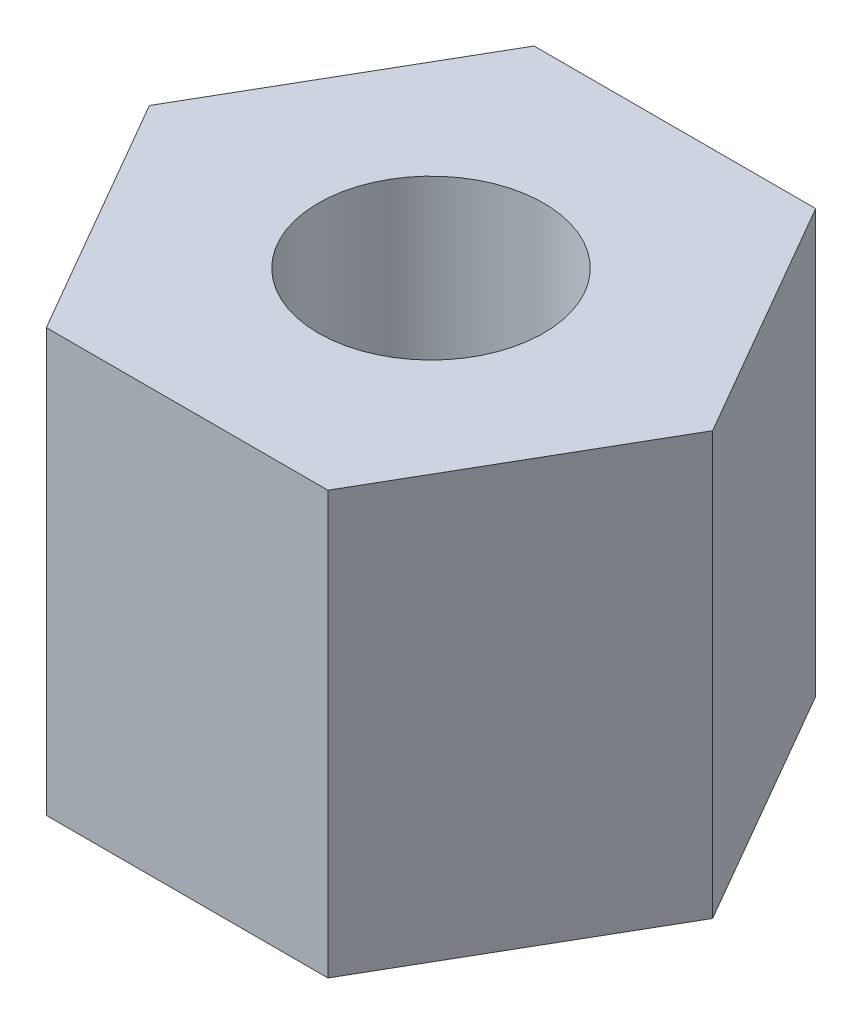
ISO-10303-21;
HEADER;
FILE_DESCRIPTION(('STEP AP214'),'2;1');
FILE_NAME('part.step','',(''),(''),'','','');
FILE_SCHEMA(('AUTOMOTIVE_DESIGN { 1 0 10303 214 1 1 1 1 }'));
ENDSEC;
DATA;
#1=APPLICATION_CONTEXT('core data for automotive mechanical design processes');
#2=APPLICATION_PROTOCOL_DEFINITION('international standard','automotive_design',2000,#1);
#3=PRODUCT_CONTEXT('',#1,'mechanical');
#4=PRODUCT('Part','Part','',(#3));
#5=PRODUCT_RELATED_PRODUCT_CATEGORY('part','',(#4));
#6=PRODUCT_DEFINITION_FORMATION('','',#4);
#7=PRODUCT_DEFINITION_CONTEXT('part definition',#1,'design');
#8=PRODUCT_DEFINITION('design','',#6,#7);
#9=PRODUCT_DEFINITION_SHAPE('','',#8);
#10=(LENGTH_UNIT() NAMED_UNIT(*) SI_UNIT(.MILLI.,.METRE.));
#11=(NAMED_UNIT(*) PLANE_ANGLE_UNIT() SI_UNIT($,.RADIAN.));
#12=(NAMED_UNIT(*) SI_UNIT($,.STERADIAN.) SOLID_ANGLE_UNIT());
#13=UNCERTAINTY_MEASURE_WITH_UNIT(LENGTH_MEASURE(1.E-05),#10,'distance_accuracy_value','');
#14=(GEOMETRIC_REPRESENTATION_CONTEXT(3) GLOBAL_UNCERTAINTY_ASSIGNED_CONTEXT((#13)) GLOBAL_UNIT_ASSIGNED_CONTEXT((#10,
#11,#12)) REPRESENTATION_CONTEXT('',''));
#15=CARTESIAN_POINT('',(0.,0.,0.));
#16=DIRECTION('',(0.,0.,1.));
#17=DIRECTION('',(1.,0.,0.));
#18=AXIS2_PLACEMENT_3D('',#15,#16,#17);
#19=CARTESIAN_POINT('',(0.,15.,0.));
#20=DIRECTION('',(0.,1.,0.));
#21=DIRECTION('',(0.,0.,1.));
#22=AXIS2_PLACEMENT_3D('',#19,#20,#21);
#23=PLANE('',#22);
#24=DIRECTION('',(-1.,0.,0.));
#25=VECTOR('',#24,1.);
#26=CARTESIAN_POINT('',(5.,15.,-8.66025403784439));
#27=LINE('',#26,#25);
#28=CARTESIAN_POINT('',(5.,15.,-8.66025403784439));
#29=VERTEX_POINT('',#28);
#30=CARTESIAN_POINT('',(-5.,15.,-8.66025403784439));
#31=VERTEX_POINT('',#30);
#32=EDGE_CURVE('E149',#29,#31,#27,.T.);
#33=ORIENTED_EDGE('',*,*,#32,.T.);
#34=DIRECTION('',(-0.5,0.,0.866025403784439));
#35=VECTOR('',#34,1.);
#36=CARTESIAN_POINT('',(-5.,15.,-8.66025403784439));
#37=LINE('',#36,#35);
#38=CARTESIAN_POINT('',(-10.,15.,0.));
#39=VERTEX_POINT('',#38);
#40=EDGE_CURVE('E107',#31,#39,#37,.T.);
#41=ORIENTED_EDGE('',*,*,#40,.T.);
#42=DIRECTION('',(0.5,0.,0.866025403784439));
#43=VECTOR('',#42,1.);
#44=CARTESIAN_POINT('',(-10.,15.,0.));
#45=LINE('',#44,#43);
#46=CARTESIAN_POINT('',(-5.00000000000001,15.,8.66025403784439));
#47=VERTEX_POINT('',#46);
#48=EDGE_CURVE('E120',#39,#47,#45,.T.);
#49=ORIENTED_EDGE('',*,*,#48,.T.);
#50=DIRECTION('',(1.,0.,0.));
#51=VECTOR('',#50,1.);
#52=CARTESIAN_POINT('',(-5.00000000000001,15.,8.66025403784439));
#53=LINE('',#52,#51);
#54=CARTESIAN_POINT('',(5.,15.,8.66025403784439));
#55=VERTEX_POINT('',#54);
#56=EDGE_CURVE('E114',#47,#55,#53,.T.);
#57=ORIENTED_EDGE('',*,*,#56,.T.);
#58=DIRECTION('',(0.5,0.,-0.866025403784439));
#59=VECTOR('',#58,1.);
#60=CARTESIAN_POINT('',(5.,15.,8.66025403784439));
#61=LINE('',#60,#59);
#62=CARTESIAN_POINT('',(10.,15.,0.));
#63=VERTEX_POINT('',#62);
#64=EDGE_CURVE('E118',#55,#63,#61,.T.);
#65=ORIENTED_EDGE('',*,*,#64,.T.);
#66=DIRECTION('',(-0.5,0.,-0.866025403784439));
#67=VECTOR('',#66,1.);
#68=CARTESIAN_POINT('',(10.,15.,0.));
#69=LINE('',#68,#67);
#70=EDGE_CURVE('E70',#63,#29,#69,.T.);
#71=ORIENTED_EDGE('',*,*,#70,.T.);
#72=EDGE_LOOP('',(#33,#41,#49,#57,#65,#71));
#73=FACE_BOUND('',#72,.T.);
#74=CARTESIAN_POINT('',(0.,15.,0.));
#75=DIRECTION('',(0.,1.,0.));
#76=DIRECTION('',(0.,0.,1.));
#77=AXIS2_PLACEMENT_3D('',#74,#75,#76);
#78=CIRCLE('',#77,4.);
#79=CARTESIAN_POINT('',(0.,15.,4.));
#80=VERTEX_POINT('',#79);
#81=EDGE_CURVE('E142',#80,#80,#78,.T.);
#82=ORIENTED_EDGE('',*,*,#81,.F.);
#83=EDGE_LOOP('',(#82));
#84=FACE_BOUND('',#83,.T.);
#85=ADVANCED_FACE('F53',(#73,#84),#23,.T.);
#86=CARTESIAN_POINT('',(0.,0.,0.));
#87=DIRECTION('',(0.,1.,0.));
#88=DIRECTION('',(0.,0.,1.));
#89=AXIS2_PLACEMENT_3D('',#86,#87,#88);
#90=PLANE('',#89);
#91=DIRECTION('',(-1.,0.,0.));
#92=VECTOR('',#91,1.);
#93=CARTESIAN_POINT('',(5.,0.,-8.66025403784439));
#94=LINE('',#93,#92);
#95=CARTESIAN_POINT('',(5.,0.,-8.66025403784439));
#96=VERTEX_POINT('',#95);
#97=CARTESIAN_POINT('',(-5.,0.,-8.66025403784439));
#98=VERTEX_POINT('',#97);
#99=EDGE_CURVE('E138',#96,#98,#94,.T.);
#100=ORIENTED_EDGE('',*,*,#99,.F.);
#101=DIRECTION('',(-0.5,0.,-0.866025403784439));
#102=VECTOR('',#101,1.);
#103=CARTESIAN_POINT('',(10.,0.,0.));
#104=LINE('',#103,#102);
#105=CARTESIAN_POINT('',(10.,0.,0.));
#106=VERTEX_POINT('',#105);
#107=EDGE_CURVE('E99',#106,#96,#104,.T.);
#108=ORIENTED_EDGE('',*,*,#107,.F.);
#109=DIRECTION('',(0.5,0.,-0.866025403784439));
#110=VECTOR('',#109,1.);
#111=CARTESIAN_POINT('',(5.,0.,8.66025403784439));
#112=LINE('',#111,#110);
#113=CARTESIAN_POINT('',(5.,0.,8.66025403784439));
#114=VERTEX_POINT('',#113);
#115=EDGE_CURVE('E93',#114,#106,#112,.T.);
#116=ORIENTED_EDGE('',*,*,#115,.F.);
#117=DIRECTION('',(1.,0.,0.));
#118=VECTOR('',#117,1.);
#119=CARTESIAN_POINT('',(-5.00000000000001,0.,8.66025403784439));
#120=LINE('',#119,#118);
#121=CARTESIAN_POINT('',(-5.00000000000001,0.,8.66025403784439));
#122=VERTEX_POINT('',#121);
#123=EDGE_CURVE('E128',#122,#114,#120,.T.);
#124=ORIENTED_EDGE('',*,*,#123,.F.);
#125=DIRECTION('',(0.5,0.,0.866025403784439));
#126=VECTOR('',#125,1.);
#127=CARTESIAN_POINT('',(-10.,0.,0.));
#128=LINE('',#127,#126);
#129=CARTESIAN_POINT('',(-10.,0.,0.));
#130=VERTEX_POINT('',#129);
#131=EDGE_CURVE('E144',#130,#122,#128,.T.);
#132=ORIENTED_EDGE('',*,*,#131,.F.);
#133=DIRECTION('',(-0.5,0.,0.866025403784439));
#134=VECTOR('',#133,1.);
#135=CARTESIAN_POINT('',(-5.,0.,-8.66025403784439));
#136=LINE('',#135,#134);
#137=EDGE_CURVE('E141',#98,#130,#136,.T.);
#138=ORIENTED_EDGE('',*,*,#137,.F.);
#139=EDGE_LOOP('',(#100,#108,#116,#124,#132,#138));
#140=FACE_BOUND('',#139,.T.);
#141=CARTESIAN_POINT('',(0.,0.,0.));
#142=DIRECTION('',(0.,1.,0.));
#143=DIRECTION('',(0.,0.,1.));
#144=AXIS2_PLACEMENT_3D('',#141,#142,#143);
#145=CIRCLE('',#144,4.);
#146=CARTESIAN_POINT('',(0.,0.,4.));
#147=VERTEX_POINT('',#146);
#148=EDGE_CURVE('E242',#147,#147,#145,.T.);
#149=ORIENTED_EDGE('',*,*,#148,.T.);
#150=EDGE_LOOP('',(#149));
#151=FACE_BOUND('',#150,.T.);
#152=ADVANCED_FACE('F158',(#140,#151),#90,.F.);
#153=CARTESIAN_POINT('',(5.,15.,-8.66025403784439));
#154=DIRECTION('',(0.,0.,1.));
#155=DIRECTION('',(1.,0.,0.));
#156=AXIS2_PLACEMENT_3D('',#153,#154,#155);
#157=PLANE('',#156);
#158=ORIENTED_EDGE('',*,*,#99,.T.);
#159=DIRECTION('',(0.,-1.,0.));
#160=VECTOR('',#159,1.);
#161=CARTESIAN_POINT('',(-5.,15.,-8.66025403784439));
#162=LINE('',#161,#160);
#163=EDGE_CURVE('E12',#31,#98,#162,.T.);
#164=ORIENTED_EDGE('',*,*,#163,.F.);
#165=ORIENTED_EDGE('',*,*,#32,.F.);
#166=DIRECTION('',(0.,-1.,0.));
#167=VECTOR('',#166,1.);
#168=CARTESIAN_POINT('',(5.,15.,-8.66025403784439));
#169=LINE('',#168,#167);
#170=EDGE_CURVE('E134',#29,#96,#169,.T.);
#171=ORIENTED_EDGE('',*,*,#170,.T.);
#172=EDGE_LOOP('',(#158,#164,#165,#171));
#173=FACE_BOUND('',#172,.T.);
#174=ADVANCED_FACE('F55',(#173),#157,.F.);
#175=CARTESIAN_POINT('',(-5.,15.,-8.66025403784439));
#176=DIRECTION('',(0.866025403784439,0.,0.5));
#177=DIRECTION('',(0.5,0.,-0.866025403784439));
#178=AXIS2_PLACEMENT_3D('',#175,#176,#177);
#179=PLANE('',#178);
#180=ORIENTED_EDGE('',*,*,#137,.T.);
#181=DIRECTION('',(0.,-1.,0.));
#182=VECTOR('',#181,1.);
#183=CARTESIAN_POINT('',(-10.,15.,0.));
#184=LINE('',#183,#182);
#185=EDGE_CURVE('E62',#39,#130,#184,.T.);
#186=ORIENTED_EDGE('',*,*,#185,.F.);
#187=ORIENTED_EDGE('',*,*,#40,.F.);
#188=ORIENTED_EDGE('',*,*,#163,.T.);
#189=EDGE_LOOP('',(#180,#186,#187,#188));
#190=FACE_BOUND('',#189,.T.);
#191=ADVANCED_FACE('F183',(#190),#179,.F.);
#192=CARTESIAN_POINT('',(-10.,15.,0.));
#193=DIRECTION('',(0.866025403784439,0.,-0.5));
#194=DIRECTION('',(-0.5,0.,-0.866025403784439));
#195=AXIS2_PLACEMENT_3D('',#192,#193,#194);
#196=PLANE('',#195);
#197=ORIENTED_EDGE('',*,*,#131,.T.);
#198=DIRECTION('',(0.,-1.,0.));
#199=VECTOR('',#198,1.);
#200=CARTESIAN_POINT('',(-5.00000000000001,15.,8.66025403784439));
#201=LINE('',#200,#199);
#202=EDGE_CURVE('E129',#47,#122,#201,.T.);
#203=ORIENTED_EDGE('',*,*,#202,.F.);
#204=ORIENTED_EDGE('',*,*,#48,.F.);
#205=ORIENTED_EDGE('',*,*,#185,.T.);
#206=EDGE_LOOP('',(#197,#203,#204,#205));
#207=FACE_BOUND('',#206,.T.);
#208=ADVANCED_FACE('F155',(#207),#196,.F.);
#209=CARTESIAN_POINT('',(-5.00000000000001,15.,8.66025403784439));
#210=DIRECTION('',(0.,0.,-1.));
#211=DIRECTION('',(-1.,0.,0.));
#212=AXIS2_PLACEMENT_3D('',#209,#210,#211);
#213=PLANE('',#212);
#214=ORIENTED_EDGE('',*,*,#123,.T.);
#215=DIRECTION('',(0.,-1.,0.));
#216=VECTOR('',#215,1.);
#217=CARTESIAN_POINT('',(5.,15.,8.66025403784439));
#218=LINE('',#217,#216);
#219=EDGE_CURVE('E125',#55,#114,#218,.T.);
#220=ORIENTED_EDGE('',*,*,#219,.F.);
#221=ORIENTED_EDGE('',*,*,#56,.F.);
#222=ORIENTED_EDGE('',*,*,#202,.T.);
#223=EDGE_LOOP('',(#214,#220,#221,#222));
#224=FACE_BOUND('',#223,.T.);
#225=ADVANCED_FACE('F126',(#224),#213,.F.);
#226=CARTESIAN_POINT('',(5.,15.,8.66025403784439));
#227=DIRECTION('',(-0.866025403784439,0.,-0.5));
#228=DIRECTION('',(-0.5,0.,0.866025403784439));
#229=AXIS2_PLACEMENT_3D('',#226,#227,#228);
#230=PLANE('',#229);
#231=ORIENTED_EDGE('',*,*,#115,.T.);
#232=DIRECTION('',(0.,-1.,0.));
#233=VECTOR('',#232,1.);
#234=CARTESIAN_POINT('',(10.,15.,0.));
#235=LINE('',#234,#233);
#236=EDGE_CURVE('E130',#63,#106,#235,.T.);
#237=ORIENTED_EDGE('',*,*,#236,.F.);
#238=ORIENTED_EDGE('',*,*,#64,.F.);
#239=ORIENTED_EDGE('',*,*,#219,.T.);
#240=EDGE_LOOP('',(#231,#237,#238,#239));
#241=FACE_BOUND('',#240,.T.);
#242=ADVANCED_FACE('F132',(#241),#230,.F.);
#243=CARTESIAN_POINT('',(10.,15.,0.));
#244=DIRECTION('',(-0.866025403784439,0.,0.5));
#245=DIRECTION('',(0.5,0.,0.866025403784439));
#246=AXIS2_PLACEMENT_3D('',#243,#244,#245);
#247=PLANE('',#246);
#248=ORIENTED_EDGE('',*,*,#107,.T.);
#249=ORIENTED_EDGE('',*,*,#170,.F.);
#250=ORIENTED_EDGE('',*,*,#70,.F.);
#251=ORIENTED_EDGE('',*,*,#236,.T.);
#252=EDGE_LOOP('',(#248,#249,#250,#251));
#253=FACE_BOUND('',#252,.T.);
#254=ADVANCED_FACE('F163',(#253),#247,.F.);
#255=CARTESIAN_POINT('',(0.,15.,0.));
#256=DIRECTION('',(0.,-1.,0.));
#257=DIRECTION('',(0.,0.,-1.));
#258=AXIS2_PLACEMENT_3D('',#255,#256,#257);
#259=CYLINDRICAL_SURFACE('',#258,4.);
#260=ORIENTED_EDGE('',*,*,#81,.T.);
#261=EDGE_LOOP('',(#260));
#262=FACE_BOUND('',#261,.T.);
#263=ORIENTED_EDGE('',*,*,#148,.F.);
#264=EDGE_LOOP('',(#263));
#265=FACE_BOUND('',#264,.T.);
#266=ADVANCED_FACE('F165',(#262,#265),#259,.F.);
#267=CLOSED_SHELL('',(#85,#152,#174,#191,#208,#225,#242,#254,#266));
#268=MANIFOLD_SOLID_BREP('B2',#267);
#269=ADVANCED_BREP_SHAPE_REPRESENTATION('',(#18,#268),#14);
#270=SHAPE_DEFINITION_REPRESENTATION(#9,#269);
ENDSEC;
END-ISO-10303-21;
